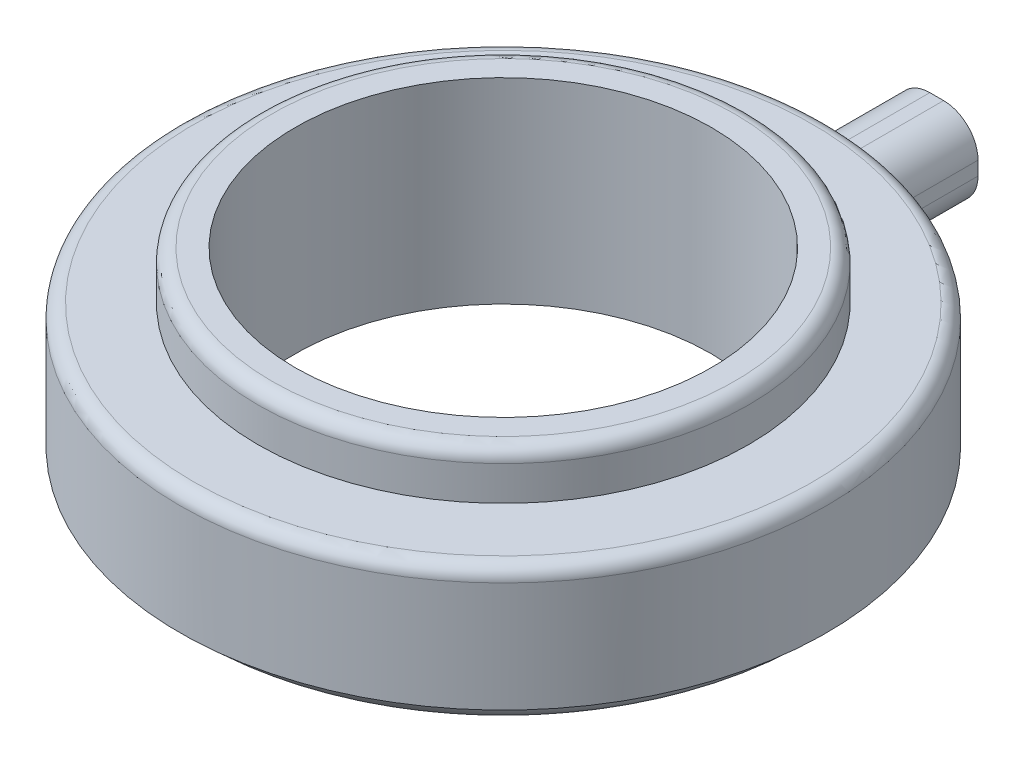
ISO-10303-21;
HEADER;
FILE_DESCRIPTION(('STEP AP214'),'2;1');
FILE_NAME('part.step','',(''),(''),'','','');
FILE_SCHEMA(('AUTOMOTIVE_DESIGN { 1 0 10303 214 1 1 1 1 }'));
ENDSEC;
DATA;
#1=APPLICATION_CONTEXT('core data for automotive mechanical design processes');
#2=APPLICATION_PROTOCOL_DEFINITION('international standard','automotive_design',2000,#1);
#3=PRODUCT_CONTEXT('',#1,'mechanical');
#4=PRODUCT('Part','Part','',(#3));
#5=PRODUCT_RELATED_PRODUCT_CATEGORY('part','',(#4));
#6=PRODUCT_DEFINITION_FORMATION('','',#4);
#7=PRODUCT_DEFINITION_CONTEXT('part definition',#1,'design');
#8=PRODUCT_DEFINITION('design','',#6,#7);
#9=PRODUCT_DEFINITION_SHAPE('','',#8);
#10=(LENGTH_UNIT() NAMED_UNIT(*) SI_UNIT(.MILLI.,.METRE.));
#11=(NAMED_UNIT(*) PLANE_ANGLE_UNIT() SI_UNIT($,.RADIAN.));
#12=(NAMED_UNIT(*) SI_UNIT($,.STERADIAN.) SOLID_ANGLE_UNIT());
#13=UNCERTAINTY_MEASURE_WITH_UNIT(LENGTH_MEASURE(1.E-05),#10,'distance_accuracy_value','');
#14=(GEOMETRIC_REPRESENTATION_CONTEXT(3) GLOBAL_UNCERTAINTY_ASSIGNED_CONTEXT((#13)) GLOBAL_UNIT_ASSIGNED_CONTEXT((#10,
#11,#12)) REPRESENTATION_CONTEXT('',''));
#15=CARTESIAN_POINT('',(0.,0.,0.));
#16=DIRECTION('',(0.,0.,1.));
#17=DIRECTION('',(1.,0.,0.));
#18=AXIS2_PLACEMENT_3D('',#15,#16,#17);
#19=CARTESIAN_POINT('',(0.,21.5,0.));
#20=DIRECTION('',(0.,-1.,0.));
#21=DIRECTION('',(0.,0.,-1.));
#22=AXIS2_PLACEMENT_3D('',#19,#20,#21);
#23=CYLINDRICAL_SURFACE('',#22,47.);
#24=DIRECTION('',(0.,-1.,0.));
#25=VECTOR('',#24,1.);
#26=CARTESIAN_POINT('',(-6.,21.5,-46.6154480832267));
#27=LINE('',#26,#25);
#28=CARTESIAN_POINT('',(-6.,9.,-46.6154480832267));
#29=VERTEX_POINT('',#28);
#30=CARTESIAN_POINT('',(-6.,11.,-46.6154480832267));
#31=VERTEX_POINT('',#30);
#32=EDGE_CURVE('E287',#29,#31,#27,.F.);
#33=ORIENTED_EDGE('',*,*,#32,.F.);
#34=CARTESIAN_POINT('',(-6.,9.,-46.6154480832267));
#35=CARTESIAN_POINT('',(-6.00001574934769,8.860013531056,-46.6154412792169));
#36=CARTESIAN_POINT('',(-5.99412180909128,8.72003001791765,-46.6162045331246));
#37=CARTESIAN_POINT('',(-5.97062883532135,8.44107511307435,-46.6192218993663));
#38=CARTESIAN_POINT('',(-5.95303069280792,8.30210364514,-46.621475898215));
#39=CARTESIAN_POINT('',(-5.90626880060237,8.02630624443322,-46.6274223022354));
#40=CARTESIAN_POINT('',(-5.87711754605926,7.88947815916102,-46.6311131533183));
#41=CARTESIAN_POINT('',(-5.80747076663345,7.61878565622905,-46.6398383587693));
#42=CARTESIAN_POINT('',(-5.76697531313486,7.48492121992604,-46.6448727046833));
#43=CARTESIAN_POINT('',(-5.67492921471568,7.22107834173954,-46.656160627077));
#44=CARTESIAN_POINT('',(-5.62337681185014,7.09110052153794,-46.6624143974187));
#45=CARTESIAN_POINT('',(-5.50957485636581,6.83591607208295,-46.6759881342003));
#46=CARTESIAN_POINT('',(-5.44732135315913,6.71071122582719,-46.6833084942469));
#47=CARTESIAN_POINT('',(-5.3126073568849,6.46604826611993,-46.6988307731633));
#48=CARTESIAN_POINT('',(-5.24015134015456,6.34658766306219,-46.7070323050484));
#49=CARTESIAN_POINT('',(-5.08549746122319,6.11413692954859,-46.724124044593));
#50=CARTESIAN_POINT('',(-5.00329599849747,6.00114921355744,-46.7330145063598));
#51=CARTESIAN_POINT('',(-4.82935410547349,5.7819711227639,-46.7513103404584));
#52=CARTESIAN_POINT('',(-4.73757191156052,5.67581407116152,-46.7607178746928));
#53=CARTESIAN_POINT('',(-4.54538970361773,5.47156087600879,-46.7797900545005));
#54=CARTESIAN_POINT('',(-4.44498648976254,5.37346775218334,-46.7894547946133));
#55=CARTESIAN_POINT('',(-4.2363093238105,5.18608291648772,-46.8088096284985));
#56=CARTESIAN_POINT('',(-4.12803663463222,5.09678979775966,-46.8184997179632));
#57=CARTESIAN_POINT('',(-3.90431982911916,4.92758010193607,-46.8376866748213));
#58=CARTESIAN_POINT('',(-3.78887317245841,4.84766687556326,-46.8471834721707));
#59=CARTESIAN_POINT('',(-3.55109645819065,4.69746915407567,-46.8658084024402));
#60=CARTESIAN_POINT('',(-3.42873703973607,4.62723089159985,-46.8749346275692));
#61=CARTESIAN_POINT('',(-3.17848750255479,4.49732647059776,-46.8925681857662));
#62=CARTESIAN_POINT('',(-3.05059737162707,4.43766033539559,-46.9010755174688));
#63=CARTESIAN_POINT('',(-2.79024906430131,4.32936080258923,-46.9172836302256));
#64=CARTESIAN_POINT('',(-2.6577932465377,4.28072180392666,-46.9249848196721));
#65=CARTESIAN_POINT('',(-2.38924774754671,4.19480754540922,-46.9394247144872));
#66=CARTESIAN_POINT('',(-2.25315886313979,4.15752981566085,-46.9461636288809));
#67=CARTESIAN_POINT('',(-1.93284837223835,4.08421652220609,-46.9605952399624));
#68=CARTESIAN_POINT('',(-1.74755503727489,4.05264545027783,-46.9678694885333));
#69=CARTESIAN_POINT('',(-1.46800538025353,4.02106689108241,-46.9771612791828));
#70=CARTESIAN_POINT('',(-1.37459349146312,4.01317038817538,-46.9799877640218));
#71=CARTESIAN_POINT('',(-1.18746446712455,4.0026375637855,-46.9850901054527));
#72=CARTESIAN_POINT('',(-1.09374735096548,4.00000091446391,-46.9873659963544));
#73=CARTESIAN_POINT('',(-1.,4.,-46.9893604978829));
#74=B_SPLINE_CURVE_WITH_KNOTS('',3,(#34,#35,#36,#37,#38,#39,#40,#41,#42,#43,#44,#45,#46,#47,#48,
#49,#50,#51,#52,#53,#54,#55,#56,#57,#58,#59,#60,#61,#62,#63,#64,#65,#66,#67,#68,#69,#70,#71,#72,
#73),.UNSPECIFIED.,.F.,.F.,(4,2,2,2,2,2,2,2,2,2,2,2,2,2,2,2,2,2,2,4),(0.,0.419828988730609,
0.839626021003011,1.25897025976916,1.67831185984388,2.09772018054929,2.51728367052916,
2.93666364795224,3.35619905400938,3.77764635715752,4.19925076885538,4.62078766889178,
5.0424746966699,5.46611163499165,5.88974950792451,6.31317171623272,6.73650180851263,
7.29944943993878,7.58068690328024,7.86190683696815),.UNSPECIFIED.);
#75=CARTESIAN_POINT('',(-1.,4.,-46.9893604978829));
#76=VERTEX_POINT('',#75);
#77=EDGE_CURVE('E157',#29,#76,#74,.T.);
#78=ORIENTED_EDGE('',*,*,#77,.T.);
#79=CARTESIAN_POINT('',(0.,4.,0.));
#80=DIRECTION('',(0.,-1.,0.));
#81=DIRECTION('',(0.,0.,-1.));
#82=AXIS2_PLACEMENT_3D('',#79,#80,#81);
#83=CIRCLE('',#82,47.);
#84=CARTESIAN_POINT('',(1.,4.,-46.9893604978829));
#85=VERTEX_POINT('',#84);
#86=EDGE_CURVE('E116',#76,#85,#83,.T.);
#87=ORIENTED_EDGE('',*,*,#86,.T.);
#88=CARTESIAN_POINT('',(1.,4.,-46.9893604978829));
#89=CARTESIAN_POINT('',(1.14043625237472,3.99998449275366,-46.9863781447174));
#90=CARTESIAN_POINT('',(1.28085548922437,4.00591602813002,-46.982753850506));
#91=CARTESIAN_POINT('',(1.56065202425006,4.02955362110235,-46.9742886480528));
#92=CARTESIAN_POINT('',(1.7000294023534,4.04725876590139,-46.9694478341448));
#93=CARTESIAN_POINT('',(1.97661618944913,4.09430020327145,-46.9586218650284));
#94=CARTESIAN_POINT('',(2.11382765215523,4.123624691697,-46.9526378743638));
#95=CARTESIAN_POINT('',(2.38525540521518,4.19368023552516,-46.9396315179745));
#96=CARTESIAN_POINT('',(2.5194717108233,4.23441123282033,-46.9326091575397));
#97=CARTESIAN_POINT('',(2.78398541207114,4.32698871007652,-46.9176617133938));
#98=CARTESIAN_POINT('',(2.91428220020307,4.37883690313399,-46.9097364906451));
#99=CARTESIAN_POINT('',(3.17007069739556,4.49329032110583,-46.8931453937677));
#100=CARTESIAN_POINT('',(3.2955606178914,4.55589950338281,-46.8844792477552));
#101=CARTESIAN_POINT('',(3.54075710899073,4.69138486955507,-46.8665994657062));
#102=CARTESIAN_POINT('',(3.66046616677715,4.76425658424032,-46.8573860689954));
#103=CARTESIAN_POINT('',(3.8933695430538,4.91980035975742,-46.8386093954491));
#104=CARTESIAN_POINT('',(4.00656157234559,5.00247583347304,-46.8290459975769));
#105=CARTESIAN_POINT('',(4.22604297372129,5.17738088842414,-46.8097505699029));
#106=CARTESIAN_POINT('',(4.33230268091697,5.2696476400412,-46.800018015729));
#107=CARTESIAN_POINT('',(4.53667443188575,5.46281127484669,-46.7806490313432));
#108=CARTESIAN_POINT('',(4.63478646745507,5.56370816672449,-46.7710126012282));
#109=CARTESIAN_POINT('',(4.82220731022703,5.77346632136886,-46.7520608550839));
#110=CARTESIAN_POINT('',(4.91151289714686,5.88233047238383,-46.7427456573244));
#111=CARTESIAN_POINT('',(5.08061741506015,6.10719092146267,-46.7246675508342));
#112=CARTESIAN_POINT('',(5.16041966545884,6.22318470763751,-46.7159044497692));
#113=CARTESIAN_POINT('',(5.3101300834582,6.46176242106981,-46.6991242554057));
#114=CARTESIAN_POINT('',(5.38001850217471,6.58435884940155,-46.6911086617629));
#115=CARTESIAN_POINT('',(5.50918273812119,6.83501877901046,-46.6760445365086));
#116=CARTESIAN_POINT('',(5.56846246672684,6.96308024369692,-46.6689956487021));
#117=CARTESIAN_POINT('',(5.67598771894725,7.22376610476713,-46.6560403278212));
#118=CARTESIAN_POINT('',(5.72423695569893,7.35638894833152,-46.6501335104012));
#119=CARTESIAN_POINT('',(5.80935540296669,7.62523123237852,-46.6396100164663));
#120=CARTESIAN_POINT('',(5.84622742916655,7.76144977390771,-46.6349930207671));
#121=CARTESIAN_POINT('',(5.91802962555219,8.07956848518346,-46.6259439809401));
#122=CARTESIAN_POINT('',(5.9487628727359,8.2624584385906,-46.6220192989134));
#123=CARTESIAN_POINT('',(5.97949919159934,8.53831092872645,-46.6180831640766));
#124=CARTESIAN_POINT('',(5.98718403212074,8.63047432876399,-46.617096272871));
#125=CARTESIAN_POINT('',(5.99743386474553,8.81508410128305,-46.6157784756304));
#126=CARTESIAN_POINT('',(5.99999918834047,8.90753045505493,-46.6154475271229));
#127=CARTESIAN_POINT('',(6.,9.,-46.6154480832267));
#128=B_SPLINE_CURVE_WITH_KNOTS('',3,(#88,#89,#90,#91,#92,#93,#94,#95,#96,#97,#98,#99,#100,#101,
#102,#103,#104,#105,#106,#107,#108,#109,#110,#111,#112,#113,#114,#115,#116,#117,#118,#119,#120,
#121,#122,#123,#124,#125,#126,#127),.UNSPECIFIED.,.F.,.F.,(4,2,2,2,2,2,2,2,2,2,2,2,2,2,2,2,2,2,
2,4),(0.,0.421272263714477,0.84251187039081,1.26332463048928,1.68413524690797,2.10501075450359,
2.52604137188058,2.94688919920982,3.36788396453829,3.79057581493644,4.21326809093205,
4.63611436543194,5.0588125087171,5.48234120735174,5.90571342972489,6.32894292397425,
6.75206759129812,7.30723756581914,7.58458174947708,7.86190797436366),.UNSPECIFIED.);
#129=CARTESIAN_POINT('',(6.,9.,-46.6154480832267));
#130=VERTEX_POINT('',#129);
#131=EDGE_CURVE('E58',#85,#130,#128,.T.);
#132=ORIENTED_EDGE('',*,*,#131,.T.);
#133=DIRECTION('',(0.,-1.,0.));
#134=VECTOR('',#133,1.);
#135=CARTESIAN_POINT('',(6.,21.5,-46.6154480832267));
#136=LINE('',#135,#134);
#137=CARTESIAN_POINT('',(6.,11.,-46.6154480832267));
#138=VERTEX_POINT('',#137);
#139=EDGE_CURVE('E105',#130,#138,#136,.F.);
#140=ORIENTED_EDGE('',*,*,#139,.T.);
#141=CARTESIAN_POINT('',(6.,11.,-46.6154480832267));
#142=CARTESIAN_POINT('',(6.00001574934769,11.139986468944,-46.6154412792169));
#143=CARTESIAN_POINT('',(5.99412180909128,11.2799699820824,-46.6162045331246));
#144=CARTESIAN_POINT('',(5.97062883532135,11.5589248869257,-46.6192218993663));
#145=CARTESIAN_POINT('',(5.95303069280791,11.69789635486,-46.621475898215));
#146=CARTESIAN_POINT('',(5.90626880060237,11.9736937555668,-46.6274223022354));
#147=CARTESIAN_POINT('',(5.87711754605926,12.110521840839,-46.6311131533183));
#148=CARTESIAN_POINT('',(5.80747076663345,12.381214343771,-46.6398383587693));
#149=CARTESIAN_POINT('',(5.76697531313486,12.515078780074,-46.6448727046833));
#150=CARTESIAN_POINT('',(5.67492921471568,12.7789216582605,-46.656160627077));
#151=CARTESIAN_POINT('',(5.62337681185014,12.9088994784621,-46.6624143974187));
#152=CARTESIAN_POINT('',(5.50957485636581,13.164083927917,-46.6759881342003));
#153=CARTESIAN_POINT('',(5.44732135315913,13.2892887741728,-46.6833084942469));
#154=CARTESIAN_POINT('',(5.3126073568849,13.5339517338801,-46.6988307731633));
#155=CARTESIAN_POINT('',(5.24015134015456,13.6534123369378,-46.7070323050484));
#156=CARTESIAN_POINT('',(5.08549746122319,13.8858630704514,-46.724124044593));
#157=CARTESIAN_POINT('',(5.00329599849747,13.9988507864426,-46.7330145063598));
#158=CARTESIAN_POINT('',(4.82935410547349,14.2180288772361,-46.7513103404584));
#159=CARTESIAN_POINT('',(4.73757191156052,14.3241859288385,-46.7607178746928));
#160=CARTESIAN_POINT('',(4.54538970361773,14.5284391239912,-46.7797900545005));
#161=CARTESIAN_POINT('',(4.44498648976254,14.6265322478167,-46.7894547946133));
#162=CARTESIAN_POINT('',(4.2363093238105,14.8139170835123,-46.8088096284985));
#163=CARTESIAN_POINT('',(4.12803663463222,14.9032102022403,-46.8184997179632));
#164=CARTESIAN_POINT('',(3.90431982911916,15.0724198980639,-46.8376866748213));
#165=CARTESIAN_POINT('',(3.7888731724584,15.1523331244367,-46.8471834721707));
#166=CARTESIAN_POINT('',(3.55109645819065,15.3025308459243,-46.8658084024402));
#167=CARTESIAN_POINT('',(3.42873703973607,15.3727691084001,-46.8749346275692));
#168=CARTESIAN_POINT('',(3.17848750255479,15.5026735294022,-46.8925681857662));
#169=CARTESIAN_POINT('',(3.05059737162708,15.5623396646044,-46.9010755174688));
#170=CARTESIAN_POINT('',(2.79024906430131,15.6706391974108,-46.9172836302256));
#171=CARTESIAN_POINT('',(2.6577932465377,15.7192781960733,-46.9249848196721));
#172=CARTESIAN_POINT('',(2.38924774754671,15.8051924545908,-46.9394247144872));
#173=CARTESIAN_POINT('',(2.25315886313979,15.8424701843391,-46.9461636288809));
#174=CARTESIAN_POINT('',(1.93284837223835,15.9157834777939,-46.9605952399624));
#175=CARTESIAN_POINT('',(1.74755503727489,15.9473545497222,-46.9678694885333));
#176=CARTESIAN_POINT('',(1.46800538025353,15.9789331089176,-46.9771612791828));
#177=CARTESIAN_POINT('',(1.37459349146312,15.9868296118246,-46.9799877640218));
#178=CARTESIAN_POINT('',(1.18746446712455,15.9973624362145,-46.9850901054527));
#179=CARTESIAN_POINT('',(1.09374735096548,15.9999990855361,-46.9873659963544));
#180=CARTESIAN_POINT('',(0.999999999999999,16.,-46.9893604978829));
#181=B_SPLINE_CURVE_WITH_KNOTS('',3,(#141,#142,#143,#144,#145,#146,#147,#148,#149,#150,#151,
#152,#153,#154,#155,#156,#157,#158,#159,#160,#161,#162,#163,#164,#165,#166,#167,#168,#169,#170,
#171,#172,#173,#174,#175,#176,#177,#178,#179,#180),.UNSPECIFIED.,.F.,.F.,(4,2,2,2,2,2,2,2,2,2,2,
2,2,2,2,2,2,2,2,4),(0.,0.419828988730611,0.839626021003014,1.25897025976917,1.67831185984388,
2.09772018054929,2.51728367052916,2.93666364795224,3.35619905400938,3.77764635715752,
4.19925076885538,4.62078766889178,5.04247469666991,5.46611163499165,5.88974950792451,
6.31317171623272,6.73650180851262,7.29944943993878,7.58068690328024,7.86190683696815),.UNSPECIFIED.);
#182=CARTESIAN_POINT('',(1.,16.,-46.9893604978829));
#183=VERTEX_POINT('',#182);
#184=EDGE_CURVE('E50',#138,#183,#181,.T.);
#185=ORIENTED_EDGE('',*,*,#184,.T.);
#186=CARTESIAN_POINT('',(0.,16.,0.));
#187=DIRECTION('',(0.,1.,0.));
#188=DIRECTION('',(0.,0.,1.));
#189=AXIS2_PLACEMENT_3D('',#186,#187,#188);
#190=CIRCLE('',#189,47.);
#191=CARTESIAN_POINT('',(-1.,16.,-46.9893604978829));
#192=VERTEX_POINT('',#191);
#193=EDGE_CURVE('E104',#183,#192,#190,.T.);
#194=ORIENTED_EDGE('',*,*,#193,.T.);
#195=CARTESIAN_POINT('',(-1.,16.,-46.9893604978829));
#196=CARTESIAN_POINT('',(-1.14043625237472,16.0000155072463,-46.9863781447174));
#197=CARTESIAN_POINT('',(-1.28085548922437,15.99408397187,-46.982753850506));
#198=CARTESIAN_POINT('',(-1.56065202425006,15.9704463788976,-46.9742886480528));
#199=CARTESIAN_POINT('',(-1.7000294023534,15.9527412340986,-46.9694478341448));
#200=CARTESIAN_POINT('',(-1.97661618944913,15.9056997967286,-46.9586218650284));
#201=CARTESIAN_POINT('',(-2.11382765215523,15.876375308303,-46.9526378743638));
#202=CARTESIAN_POINT('',(-2.38525540521518,15.8063197644748,-46.9396315179745));
#203=CARTESIAN_POINT('',(-2.5194717108233,15.7655887671797,-46.9326091575397));
#204=CARTESIAN_POINT('',(-2.78398541207114,15.6730112899235,-46.9176617133938));
#205=CARTESIAN_POINT('',(-2.91428220020307,15.621163096866,-46.9097364906451));
#206=CARTESIAN_POINT('',(-3.17007069739556,15.5067096788942,-46.8931453937677));
#207=CARTESIAN_POINT('',(-3.2955606178914,15.4441004966172,-46.8844792477552));
#208=CARTESIAN_POINT('',(-3.54075710899074,15.3086151304449,-46.8665994657062));
#209=CARTESIAN_POINT('',(-3.66046616677715,15.2357434157597,-46.8573860689954));
#210=CARTESIAN_POINT('',(-3.8933695430538,15.0801996402426,-46.8386093954491));
#211=CARTESIAN_POINT('',(-4.00656157234559,14.997524166527,-46.8290459975769));
#212=CARTESIAN_POINT('',(-4.22604297372129,14.8226191115759,-46.8097505699029));
#213=CARTESIAN_POINT('',(-4.33230268091697,14.7303523599588,-46.800018015729));
#214=CARTESIAN_POINT('',(-4.53667443188575,14.5371887251533,-46.7806490313432));
#215=CARTESIAN_POINT('',(-4.63478646745508,14.4362918332755,-46.7710126012282));
#216=CARTESIAN_POINT('',(-4.82220731022703,14.2265336786311,-46.7520608550839));
#217=CARTESIAN_POINT('',(-4.91151289714686,14.1176695276162,-46.7427456573244));
#218=CARTESIAN_POINT('',(-5.08061741506015,13.8928090785373,-46.7246675508342));
#219=CARTESIAN_POINT('',(-5.16041966545884,13.7768152923625,-46.7159044497692));
#220=CARTESIAN_POINT('',(-5.3101300834582,13.5382375789302,-46.6991242554057));
#221=CARTESIAN_POINT('',(-5.38001850217471,13.4156411505985,-46.6911086617629));
#222=CARTESIAN_POINT('',(-5.50918273812119,13.1649812209895,-46.6760445365086));
#223=CARTESIAN_POINT('',(-5.56846246672684,13.0369197563031,-46.6689956487021));
#224=CARTESIAN_POINT('',(-5.67598771894725,12.7762338952329,-46.6560403278212));
#225=CARTESIAN_POINT('',(-5.72423695569893,12.6436110516685,-46.6501335104012));
#226=CARTESIAN_POINT('',(-5.80935540296669,12.3747687676215,-46.6396100164663));
#227=CARTESIAN_POINT('',(-5.84622742916655,12.2385502260923,-46.6349930207671));
#228=CARTESIAN_POINT('',(-5.91802962555219,11.9204315148165,-46.6259439809401));
#229=CARTESIAN_POINT('',(-5.9487628727359,11.7375415614094,-46.6220192989134));
#230=CARTESIAN_POINT('',(-5.97949919159934,11.4616890712736,-46.6180831640766));
#231=CARTESIAN_POINT('',(-5.98718403212074,11.369525671236,-46.617096272871));
#232=CARTESIAN_POINT('',(-5.99743386474553,11.1849158987169,-46.6157784756304));
#233=CARTESIAN_POINT('',(-5.99999918834047,11.0924695449451,-46.6154475271229));
#234=CARTESIAN_POINT('',(-6.,11.,-46.6154480832267));
#235=B_SPLINE_CURVE_WITH_KNOTS('',3,(#195,#196,#197,#198,#199,#200,#201,#202,#203,#204,#205,
#206,#207,#208,#209,#210,#211,#212,#213,#214,#215,#216,#217,#218,#219,#220,#221,#222,#223,#224,
#225,#226,#227,#228,#229,#230,#231,#232,#233,#234),.UNSPECIFIED.,.F.,.F.,(4,2,2,2,2,2,2,2,2,2,2,
2,2,2,2,2,2,2,2,4),(0.,0.421272263714477,0.84251187039081,1.26332463048928,1.68413524690797,
2.10501075450359,2.52604137188058,2.94688919920982,3.36788396453829,3.79057581493644,
4.21326809093206,4.63611436543195,5.0588125087171,5.48234120735174,5.90571342972489,
6.32894292397425,6.75206759129812,7.30723756581913,7.58458174947708,7.86190797436366),.UNSPECIFIED.);
#236=EDGE_CURVE('E150',#192,#31,#235,.T.);
#237=ORIENTED_EDGE('',*,*,#236,.T.);
#238=EDGE_LOOP('',(#33,#78,#87,#132,#140,#185,#194,#237));
#239=FACE_BOUND('',#238,.T.);
#240=CARTESIAN_POINT('',(0.,19.5,0.));
#241=DIRECTION('',(0.,1.,0.));
#242=DIRECTION('',(0.,0.,1.));
#243=AXIS2_PLACEMENT_3D('',#240,#241,#242);
#244=CIRCLE('',#243,47.);
#245=CARTESIAN_POINT('',(0.,19.5,47.));
#246=VERTEX_POINT('',#245);
#247=EDGE_CURVE('E121',#246,#246,#244,.F.);
#248=ORIENTED_EDGE('',*,*,#247,.T.);
#249=EDGE_LOOP('',(#248));
#250=FACE_BOUND('',#249,.T.);
#251=CARTESIAN_POINT('',(0.,3.5,0.));
#252=DIRECTION('',(0.,-1.,0.));
#253=DIRECTION('',(0.,0.,-1.));
#254=AXIS2_PLACEMENT_3D('',#251,#252,#253);
#255=CIRCLE('',#254,47.);
#256=CARTESIAN_POINT('',(0.,3.5,-47.));
#257=VERTEX_POINT('',#256);
#258=EDGE_CURVE('E264',#257,#257,#255,.T.);
#259=ORIENTED_EDGE('',*,*,#258,.F.);
#260=EDGE_LOOP('',(#259));
#261=FACE_BOUND('',#260,.T.);
#262=ADVANCED_FACE('F35',(#239,#250,#261),#23,.T.);
#263=CARTESIAN_POINT('',(0.,0.,0.));
#264=DIRECTION('',(0.,1.,0.));
#265=DIRECTION('',(0.,0.,1.));
#266=AXIS2_PLACEMENT_3D('',#263,#264,#265);
#267=PLANE('',#266);
#268=CARTESIAN_POINT('',(0.,0.,0.));
#269=DIRECTION('',(0.,1.,0.));
#270=DIRECTION('',(0.,0.,1.));
#271=AXIS2_PLACEMENT_3D('',#268,#269,#270);
#272=CIRCLE('',#271,42.);
#273=CARTESIAN_POINT('',(0.,0.,42.));
#274=VERTEX_POINT('',#273);
#275=EDGE_CURVE('E43',#274,#274,#272,.F.);
#276=ORIENTED_EDGE('',*,*,#275,.T.);
#277=EDGE_LOOP('',(#276));
#278=FACE_BOUND('',#277,.T.);
#279=CARTESIAN_POINT('',(0.,0.,0.));
#280=DIRECTION('',(0.,1.,0.));
#281=DIRECTION('',(0.,0.,1.));
#282=AXIS2_PLACEMENT_3D('',#279,#280,#281);
#283=CIRCLE('',#282,30.25);
#284=CARTESIAN_POINT('',(0.,0.,30.25));
#285=VERTEX_POINT('',#284);
#286=EDGE_CURVE('E291',#285,#285,#283,.T.);
#287=ORIENTED_EDGE('',*,*,#286,.T.);
#288=EDGE_LOOP('',(#287));
#289=FACE_BOUND('',#288,.T.);
#290=ADVANCED_FACE('F192',(#278,#289),#267,.F.);
#291=CARTESIAN_POINT('',(0.,0.,0.));
#292=DIRECTION('',(0.,1.,0.));
#293=DIRECTION('',(0.,0.,1.));
#294=AXIS2_PLACEMENT_3D('',#291,#292,#293);
#295=CYLINDRICAL_SURFACE('',#294,30.25);
#296=ORIENTED_EDGE('',*,*,#286,.F.);
#297=EDGE_LOOP('',(#296));
#298=FACE_BOUND('',#297,.T.);
#299=CARTESIAN_POINT('',(0.,28.5,0.));
#300=DIRECTION('',(0.,1.,0.));
#301=DIRECTION('',(0.,0.,1.));
#302=AXIS2_PLACEMENT_3D('',#299,#300,#301);
#303=CIRCLE('',#302,30.25);
#304=CARTESIAN_POINT('',(0.,28.5,30.25));
#305=VERTEX_POINT('',#304);
#306=EDGE_CURVE('E115',#305,#305,#303,.T.);
#307=ORIENTED_EDGE('',*,*,#306,.T.);
#308=EDGE_LOOP('',(#307));
#309=FACE_BOUND('',#308,.T.);
#310=ADVANCED_FACE('F209',(#298,#309),#295,.F.);
#311=CARTESIAN_POINT('',(0.,21.5,0.));
#312=DIRECTION('',(0.,1.,0.));
#313=DIRECTION('',(0.,0.,1.));
#314=AXIS2_PLACEMENT_3D('',#311,#312,#313);
#315=PLANE('',#314);
#316=CARTESIAN_POINT('',(0.,21.5,0.));
#317=DIRECTION('',(0.,1.,0.));
#318=DIRECTION('',(0.,0.,1.));
#319=AXIS2_PLACEMENT_3D('',#316,#317,#318);
#320=CIRCLE('',#319,45.);
#321=CARTESIAN_POINT('',(0.,21.5,45.));
#322=VERTEX_POINT('',#321);
#323=EDGE_CURVE('E126',#322,#322,#320,.T.);
#324=ORIENTED_EDGE('',*,*,#323,.T.);
#325=EDGE_LOOP('',(#324));
#326=FACE_BOUND('',#325,.T.);
#327=CARTESIAN_POINT('',(0.,21.5,0.));
#328=DIRECTION('',(0.,1.,0.));
#329=DIRECTION('',(0.,0.,1.));
#330=AXIS2_PLACEMENT_3D('',#327,#328,#329);
#331=CIRCLE('',#330,35.65);
#332=CARTESIAN_POINT('',(0.,21.5,35.65));
#333=VERTEX_POINT('',#332);
#334=EDGE_CURVE('E294',#333,#333,#331,.T.);
#335=ORIENTED_EDGE('',*,*,#334,.F.);
#336=EDGE_LOOP('',(#335));
#337=FACE_BOUND('',#336,.T.);
#338=ADVANCED_FACE('F213',(#326,#337),#315,.T.);
#339=CARTESIAN_POINT('',(0.,28.5,0.));
#340=DIRECTION('',(0.,-1.,0.));
#341=DIRECTION('',(0.,0.,-1.));
#342=AXIS2_PLACEMENT_3D('',#339,#340,#341);
#343=CYLINDRICAL_SURFACE('',#342,35.65);
#344=CARTESIAN_POINT('',(0.,26.5,0.));
#345=DIRECTION('',(0.,1.,0.));
#346=DIRECTION('',(0.,0.,1.));
#347=AXIS2_PLACEMENT_3D('',#344,#345,#346);
#348=CIRCLE('',#347,35.65);
#349=CARTESIAN_POINT('',(0.,26.5,35.65));
#350=VERTEX_POINT('',#349);
#351=EDGE_CURVE('E302',#350,#350,#348,.F.);
#352=ORIENTED_EDGE('',*,*,#351,.T.);
#353=EDGE_LOOP('',(#352));
#354=FACE_BOUND('',#353,.T.);
#355=ORIENTED_EDGE('',*,*,#334,.T.);
#356=EDGE_LOOP('',(#355));
#357=FACE_BOUND('',#356,.T.);
#358=ADVANCED_FACE('F219',(#354,#357),#343,.T.);
#359=CARTESIAN_POINT('',(0.,28.5,0.));
#360=DIRECTION('',(0.,1.,0.));
#361=DIRECTION('',(0.,0.,1.));
#362=AXIS2_PLACEMENT_3D('',#359,#360,#361);
#363=PLANE('',#362);
#364=CARTESIAN_POINT('',(0.,28.5,0.));
#365=DIRECTION('',(0.,1.,0.));
#366=DIRECTION('',(0.,0.,1.));
#367=AXIS2_PLACEMENT_3D('',#364,#365,#366);
#368=CIRCLE('',#367,33.65);
#369=CARTESIAN_POINT('',(0.,28.5,33.65));
#370=VERTEX_POINT('',#369);
#371=EDGE_CURVE('E299',#370,#370,#368,.T.);
#372=ORIENTED_EDGE('',*,*,#371,.T.);
#373=EDGE_LOOP('',(#372));
#374=FACE_BOUND('',#373,.T.);
#375=ORIENTED_EDGE('',*,*,#306,.F.);
#376=EDGE_LOOP('',(#375));
#377=FACE_BOUND('',#376,.T.);
#378=ADVANCED_FACE('F223',(#374,#377),#363,.T.);
#379=CARTESIAN_POINT('',(0.,26.5,0.));
#380=DIRECTION('',(0.,1.,0.));
#381=DIRECTION('',(0.,0.,1.));
#382=AXIS2_PLACEMENT_3D('',#379,#380,#381);
#383=TOROIDAL_SURFACE('',#382,33.65,2.);
#384=ORIENTED_EDGE('',*,*,#351,.F.);
#385=EDGE_LOOP('',(#384));
#386=FACE_BOUND('',#385,.T.);
#387=ORIENTED_EDGE('',*,*,#371,.F.);
#388=EDGE_LOOP('',(#387));
#389=FACE_BOUND('',#388,.T.);
#390=ADVANCED_FACE('F226',(#386,#389),#383,.T.);
#391=CARTESIAN_POINT('',(0.,19.5,0.));
#392=DIRECTION('',(0.,1.,0.));
#393=DIRECTION('',(0.,0.,1.));
#394=AXIS2_PLACEMENT_3D('',#391,#392,#393);
#395=TOROIDAL_SURFACE('',#394,45.,2.);
#396=ORIENTED_EDGE('',*,*,#247,.F.);
#397=EDGE_LOOP('',(#396));
#398=FACE_BOUND('',#397,.T.);
#399=ORIENTED_EDGE('',*,*,#323,.F.);
#400=EDGE_LOOP('',(#399));
#401=FACE_BOUND('',#400,.T.);
#402=ADVANCED_FACE('F173',(#398,#401),#395,.T.);
#403=CARTESIAN_POINT('',(-6.,16.,40.611126825247));
#404=DIRECTION('',(0.,1.,0.));
#405=DIRECTION('',(0.,0.,1.));
#406=AXIS2_PLACEMENT_3D('',#403,#404,#405);
#407=PLANE('',#406);
#408=DIRECTION('',(1.,0.,0.));
#409=VECTOR('',#408,1.);
#410=CARTESIAN_POINT('',(-6.,16.,-63.));
#411=LINE('',#410,#409);
#412=CARTESIAN_POINT('',(-1.,16.,-63.));
#413=VERTEX_POINT('',#412);
#414=CARTESIAN_POINT('',(1.,16.,-63.));
#415=VERTEX_POINT('',#414);
#416=EDGE_CURVE('E282',#413,#415,#411,.T.);
#417=ORIENTED_EDGE('',*,*,#416,.F.);
#418=DIRECTION('',(0.,0.,1.));
#419=VECTOR('',#418,1.);
#420=CARTESIAN_POINT('',(-1.,16.,-46.6154480832267));
#421=LINE('',#420,#419);
#422=EDGE_CURVE('E114',#413,#192,#421,.T.);
#423=ORIENTED_EDGE('',*,*,#422,.T.);
#424=ORIENTED_EDGE('',*,*,#193,.F.);
#425=DIRECTION('',(0.,0.,1.));
#426=VECTOR('',#425,1.);
#427=CARTESIAN_POINT('',(1.,16.,40.611126825247));
#428=LINE('',#427,#426);
#429=EDGE_CURVE('E111',#183,#415,#428,.F.);
#430=ORIENTED_EDGE('',*,*,#429,.T.);
#431=EDGE_LOOP('',(#417,#423,#424,#430));
#432=FACE_BOUND('',#431,.T.);
#433=ADVANCED_FACE('F110',(#432),#407,.T.);
#434=CARTESIAN_POINT('',(-6.,4.,40.611126825247));
#435=DIRECTION('',(0.,-1.,0.));
#436=DIRECTION('',(0.,0.,-1.));
#437=AXIS2_PLACEMENT_3D('',#434,#435,#436);
#438=PLANE('',#437);
#439=ORIENTED_EDGE('',*,*,#86,.F.);
#440=DIRECTION('',(0.,0.,-1.));
#441=VECTOR('',#440,1.);
#442=CARTESIAN_POINT('',(-1.,4.,-63.));
#443=LINE('',#442,#441);
#444=CARTESIAN_POINT('',(-1.,4.,-63.));
#445=VERTEX_POINT('',#444);
#446=EDGE_CURVE('E142',#76,#445,#443,.T.);
#447=ORIENTED_EDGE('',*,*,#446,.T.);
#448=DIRECTION('',(1.,0.,0.));
#449=VECTOR('',#448,1.);
#450=CARTESIAN_POINT('',(-6.,4.,-63.));
#451=LINE('',#450,#449);
#452=CARTESIAN_POINT('',(1.,4.,-63.));
#453=VERTEX_POINT('',#452);
#454=EDGE_CURVE('E281',#445,#453,#451,.T.);
#455=ORIENTED_EDGE('',*,*,#454,.T.);
#456=DIRECTION('',(0.,0.,-1.));
#457=VECTOR('',#456,1.);
#458=CARTESIAN_POINT('',(1.,4.,40.611126825247));
#459=LINE('',#458,#457);
#460=EDGE_CURVE('E140',#453,#85,#459,.F.);
#461=ORIENTED_EDGE('',*,*,#460,.T.);
#462=EDGE_LOOP('',(#439,#447,#455,#461));
#463=FACE_BOUND('',#462,.T.);
#464=ADVANCED_FACE('F229',(#463),#438,.T.);
#465=CARTESIAN_POINT('',(-6.,4.,40.611126825247));
#466=DIRECTION('',(1.,0.,0.));
#467=DIRECTION('',(0.,0.,-1.));
#468=AXIS2_PLACEMENT_3D('',#465,#466,#467);
#469=PLANE('',#468);
#470=ORIENTED_EDGE('',*,*,#32,.T.);
#471=DIRECTION('',(0.,0.,1.));
#472=VECTOR('',#471,1.);
#473=CARTESIAN_POINT('',(-6.,11.,-63.));
#474=LINE('',#473,#472);
#475=CARTESIAN_POINT('',(-6.,11.,-63.));
#476=VERTEX_POINT('',#475);
#477=EDGE_CURVE('E131',#31,#476,#474,.F.);
#478=ORIENTED_EDGE('',*,*,#477,.T.);
#479=DIRECTION('',(0.,1.,0.));
#480=VECTOR('',#479,1.);
#481=CARTESIAN_POINT('',(-6.,16.,-63.));
#482=LINE('',#481,#480);
#483=CARTESIAN_POINT('',(-6.,9.,-63.));
#484=VERTEX_POINT('',#483);
#485=EDGE_CURVE('E278',#484,#476,#482,.T.);
#486=ORIENTED_EDGE('',*,*,#485,.F.);
#487=DIRECTION('',(0.,0.,-1.));
#488=VECTOR('',#487,1.);
#489=CARTESIAN_POINT('',(-6.,9.,-46.6154480832267));
#490=LINE('',#489,#488);
#491=EDGE_CURVE('E123',#484,#29,#490,.F.);
#492=ORIENTED_EDGE('',*,*,#491,.T.);
#493=EDGE_LOOP('',(#470,#478,#486,#492));
#494=FACE_BOUND('',#493,.T.);
#495=ADVANCED_FACE('F232',(#494),#469,.F.);
#496=CARTESIAN_POINT('',(6.,4.,40.611126825247));
#497=DIRECTION('',(1.,0.,0.));
#498=DIRECTION('',(0.,0.,-1.));
#499=AXIS2_PLACEMENT_3D('',#496,#497,#498);
#500=PLANE('',#499);
#501=ORIENTED_EDGE('',*,*,#139,.F.);
#502=DIRECTION('',(0.,0.,-1.));
#503=VECTOR('',#502,1.);
#504=CARTESIAN_POINT('',(6.,9.00000000000001,40.611126825247));
#505=LINE('',#504,#503);
#506=CARTESIAN_POINT('',(6.,9.,-63.));
#507=VERTEX_POINT('',#506);
#508=EDGE_CURVE('E147',#130,#507,#505,.T.);
#509=ORIENTED_EDGE('',*,*,#508,.T.);
#510=DIRECTION('',(0.,1.,0.));
#511=VECTOR('',#510,1.);
#512=CARTESIAN_POINT('',(6.,16.,-63.));
#513=LINE('',#512,#511);
#514=CARTESIAN_POINT('',(6.,11.,-63.));
#515=VERTEX_POINT('',#514);
#516=EDGE_CURVE('E274',#507,#515,#513,.T.);
#517=ORIENTED_EDGE('',*,*,#516,.T.);
#518=DIRECTION('',(0.,0.,1.));
#519=VECTOR('',#518,1.);
#520=CARTESIAN_POINT('',(6.,11.,40.611126825247));
#521=LINE('',#520,#519);
#522=EDGE_CURVE('E145',#515,#138,#521,.T.);
#523=ORIENTED_EDGE('',*,*,#522,.T.);
#524=EDGE_LOOP('',(#501,#509,#517,#523));
#525=FACE_BOUND('',#524,.T.);
#526=ADVANCED_FACE('F236',(#525),#500,.T.);
#527=CARTESIAN_POINT('',(-6.,16.,-63.));
#528=DIRECTION('',(0.,0.,-1.));
#529=DIRECTION('',(-1.,0.,0.));
#530=AXIS2_PLACEMENT_3D('',#527,#528,#529);
#531=PLANE('',#530);
#532=CARTESIAN_POINT('',(0.,10.,-63.));
#533=DIRECTION('',(0.,0.,-1.));
#534=DIRECTION('',(-1.,0.,0.));
#535=AXIS2_PLACEMENT_3D('',#532,#533,#534);
#536=CIRCLE('',#535,3.75);
#537=CARTESIAN_POINT('',(-3.75,10.,-63.));
#538=VERTEX_POINT('',#537);
#539=EDGE_CURVE('E266',#538,#538,#536,.T.);
#540=ORIENTED_EDGE('',*,*,#539,.F.);
#541=EDGE_LOOP('',(#540));
#542=FACE_BOUND('',#541,.T.);
#543=ORIENTED_EDGE('',*,*,#485,.T.);
#544=CARTESIAN_POINT('',(-1.,11.,-63.));
#545=DIRECTION('',(0.,0.,-1.));
#546=DIRECTION('',(-1.,0.,0.));
#547=AXIS2_PLACEMENT_3D('',#544,#545,#546);
#548=CIRCLE('',#547,5.);
#549=EDGE_CURVE('E138',#476,#413,#548,.T.);
#550=ORIENTED_EDGE('',*,*,#549,.T.);
#551=ORIENTED_EDGE('',*,*,#416,.T.);
#552=CARTESIAN_POINT('',(1.,11.,-63.));
#553=DIRECTION('',(0.,0.,-1.));
#554=DIRECTION('',(-1.,0.,0.));
#555=AXIS2_PLACEMENT_3D('',#552,#553,#554);
#556=CIRCLE('',#555,5.);
#557=EDGE_CURVE('E120',#415,#515,#556,.T.);
#558=ORIENTED_EDGE('',*,*,#557,.T.);
#559=ORIENTED_EDGE('',*,*,#516,.F.);
#560=CARTESIAN_POINT('',(1.,9.,-63.));
#561=DIRECTION('',(0.,0.,-1.));
#562=DIRECTION('',(-1.,0.,0.));
#563=AXIS2_PLACEMENT_3D('',#560,#561,#562);
#564=CIRCLE('',#563,5.);
#565=EDGE_CURVE('E134',#507,#453,#564,.T.);
#566=ORIENTED_EDGE('',*,*,#565,.T.);
#567=ORIENTED_EDGE('',*,*,#454,.F.);
#568=CARTESIAN_POINT('',(-1.,9.,-63.));
#569=DIRECTION('',(0.,0.,-1.));
#570=DIRECTION('',(-1.,0.,0.));
#571=AXIS2_PLACEMENT_3D('',#568,#569,#570);
#572=CIRCLE('',#571,5.);
#573=EDGE_CURVE('E136',#445,#484,#572,.T.);
#574=ORIENTED_EDGE('',*,*,#573,.T.);
#575=EDGE_LOOP('',(#543,#550,#551,#558,#559,#566,#567,#574));
#576=FACE_BOUND('',#575,.T.);
#577=ADVANCED_FACE('F171',(#542,#576),#531,.T.);
#578=CARTESIAN_POINT('',(-1.,11.,40.611126825247));
#579=DIRECTION('',(0.,0.,-1.));
#580=DIRECTION('',(0.,1.,0.));
#581=AXIS2_PLACEMENT_3D('',#578,#579,#580);
#582=CYLINDRICAL_SURFACE('',#581,5.);
#583=ORIENTED_EDGE('',*,*,#549,.F.);
#584=ORIENTED_EDGE('',*,*,#477,.F.);
#585=ORIENTED_EDGE('',*,*,#236,.F.);
#586=ORIENTED_EDGE('',*,*,#422,.F.);
#587=EDGE_LOOP('',(#583,#584,#585,#586));
#588=FACE_BOUND('',#587,.T.);
#589=ADVANCED_FACE('F166',(#588),#582,.T.);
#590=CARTESIAN_POINT('',(-1.,9.00000000000001,40.611126825247));
#591=DIRECTION('',(0.,0.,1.));
#592=DIRECTION('',(0.,-1.,0.));
#593=AXIS2_PLACEMENT_3D('',#590,#591,#592);
#594=CYLINDRICAL_SURFACE('',#593,5.);
#595=ORIENTED_EDGE('',*,*,#77,.F.);
#596=ORIENTED_EDGE('',*,*,#491,.F.);
#597=ORIENTED_EDGE('',*,*,#573,.F.);
#598=ORIENTED_EDGE('',*,*,#446,.F.);
#599=EDGE_LOOP('',(#595,#596,#597,#598));
#600=FACE_BOUND('',#599,.T.);
#601=ADVANCED_FACE('F170',(#600),#594,.T.);
#602=CARTESIAN_POINT('',(1.,9.00000000000001,40.611126825247));
#603=DIRECTION('',(0.,0.,-1.));
#604=DIRECTION('',(0.,1.,0.));
#605=AXIS2_PLACEMENT_3D('',#602,#603,#604);
#606=CYLINDRICAL_SURFACE('',#605,5.);
#607=ORIENTED_EDGE('',*,*,#131,.F.);
#608=ORIENTED_EDGE('',*,*,#460,.F.);
#609=ORIENTED_EDGE('',*,*,#565,.F.);
#610=ORIENTED_EDGE('',*,*,#508,.F.);
#611=EDGE_LOOP('',(#607,#608,#609,#610));
#612=FACE_BOUND('',#611,.T.);
#613=ADVANCED_FACE('F177',(#612),#606,.T.);
#614=CARTESIAN_POINT('',(1.,11.,40.611126825247));
#615=DIRECTION('',(0.,0.,1.));
#616=DIRECTION('',(0.,-1.,0.));
#617=AXIS2_PLACEMENT_3D('',#614,#615,#616);
#618=CYLINDRICAL_SURFACE('',#617,5.);
#619=ORIENTED_EDGE('',*,*,#557,.F.);
#620=ORIENTED_EDGE('',*,*,#429,.F.);
#621=ORIENTED_EDGE('',*,*,#184,.F.);
#622=ORIENTED_EDGE('',*,*,#522,.F.);
#623=EDGE_LOOP('',(#619,#620,#621,#622));
#624=FACE_BOUND('',#623,.T.);
#625=ADVANCED_FACE('F119',(#624),#618,.T.);
#626=CARTESIAN_POINT('',(0.,10.,-57.));
#627=DIRECTION('',(0.,0.,-1.));
#628=DIRECTION('',(-1.,0.,0.));
#629=AXIS2_PLACEMENT_3D('',#626,#627,#628);
#630=CYLINDRICAL_SURFACE('',#629,3.75);
#631=CARTESIAN_POINT('',(0.,10.,-57.));
#632=DIRECTION('',(0.,0.,-1.));
#633=DIRECTION('',(-1.,0.,0.));
#634=AXIS2_PLACEMENT_3D('',#631,#632,#633);
#635=CIRCLE('',#634,3.75);
#636=CARTESIAN_POINT('',(-3.75,10.,-57.));
#637=VERTEX_POINT('',#636);
#638=EDGE_CURVE('E269',#637,#637,#635,.T.);
#639=ORIENTED_EDGE('',*,*,#638,.F.);
#640=EDGE_LOOP('',(#639));
#641=FACE_BOUND('',#640,.T.);
#642=ORIENTED_EDGE('',*,*,#539,.T.);
#643=EDGE_LOOP('',(#642));
#644=FACE_BOUND('',#643,.T.);
#645=ADVANCED_FACE('F246',(#641,#644),#630,.F.);
#646=CARTESIAN_POINT('',(0.,10.,-57.));
#647=DIRECTION('',(0.,0.,-1.));
#648=DIRECTION('',(-1.,0.,0.));
#649=AXIS2_PLACEMENT_3D('',#646,#647,#648);
#650=PLANE('',#649);
#651=ORIENTED_EDGE('',*,*,#638,.T.);
#652=EDGE_LOOP('',(#651));
#653=FACE_BOUND('',#652,.T.);
#654=ADVANCED_FACE('F249',(#653),#650,.T.);
#655=CARTESIAN_POINT('',(0.,3.5,0.));
#656=DIRECTION('',(0.,-1.,0.));
#657=DIRECTION('',(0.,0.,-1.));
#658=AXIS2_PLACEMENT_3D('',#655,#656,#657);
#659=PLANE('',#658);
#660=CARTESIAN_POINT('',(0.,3.5,0.));
#661=DIRECTION('',(0.,-1.,0.));
#662=DIRECTION('',(0.,0.,-1.));
#663=AXIS2_PLACEMENT_3D('',#660,#661,#662);
#664=CIRCLE('',#663,45.);
#665=CARTESIAN_POINT('',(0.,3.5,-45.));
#666=VERTEX_POINT('',#665);
#667=EDGE_CURVE('E261',#666,#666,#664,.T.);
#668=ORIENTED_EDGE('',*,*,#667,.F.);
#669=EDGE_LOOP('',(#668));
#670=FACE_BOUND('',#669,.T.);
#671=ORIENTED_EDGE('',*,*,#258,.T.);
#672=EDGE_LOOP('',(#671));
#673=FACE_BOUND('',#672,.T.);
#674=ADVANCED_FACE('F201',(#670,#673),#659,.T.);
#675=CARTESIAN_POINT('',(0.,3.5,0.));
#676=DIRECTION('',(0.,-1.,0.));
#677=DIRECTION('',(0.,0.,-1.));
#678=AXIS2_PLACEMENT_3D('',#675,#676,#677);
#679=CYLINDRICAL_SURFACE('',#678,45.);
#680=CARTESIAN_POINT('',(0.,3.,0.));
#681=DIRECTION('',(0.,1.,0.));
#682=DIRECTION('',(0.,0.,1.));
#683=AXIS2_PLACEMENT_3D('',#680,#681,#682);
#684=CIRCLE('',#683,45.);
#685=CARTESIAN_POINT('',(0.,3.,45.));
#686=VERTEX_POINT('',#685);
#687=EDGE_CURVE('E11',#686,#686,#684,.T.);
#688=ORIENTED_EDGE('',*,*,#687,.T.);
#689=EDGE_LOOP('',(#688));
#690=FACE_BOUND('',#689,.T.);
#691=ORIENTED_EDGE('',*,*,#667,.T.);
#692=EDGE_LOOP('',(#691));
#693=FACE_BOUND('',#692,.T.);
#694=ADVANCED_FACE('F196',(#690,#693),#679,.T.);
#695=CARTESIAN_POINT('',(0.,3.,0.));
#696=DIRECTION('',(0.,1.,0.));
#697=DIRECTION('',(0.,0.,1.));
#698=AXIS2_PLACEMENT_3D('',#695,#696,#697);
#699=TOROIDAL_SURFACE('',#698,42.,3.);
#700=ORIENTED_EDGE('',*,*,#687,.F.);
#701=EDGE_LOOP('',(#700));
#702=FACE_BOUND('',#701,.T.);
#703=ORIENTED_EDGE('',*,*,#275,.F.);
#704=EDGE_LOOP('',(#703));
#705=FACE_BOUND('',#704,.T.);
#706=ADVANCED_FACE('F37',(#702,#705),#699,.T.);
#707=CLOSED_SHELL('',(#262,#290,#310,#338,#358,#378,#390,#402,#433,#464,#495,#526,#577,#589,
#601,#613,#625,#645,#654,#674,#694,#706));
#708=MANIFOLD_SOLID_BREP('B2',#707);
#709=ADVANCED_BREP_SHAPE_REPRESENTATION('',(#18,#708),#14);
#710=SHAPE_DEFINITION_REPRESENTATION(#9,#709);
ENDSEC;
END-ISO-10303-21;
